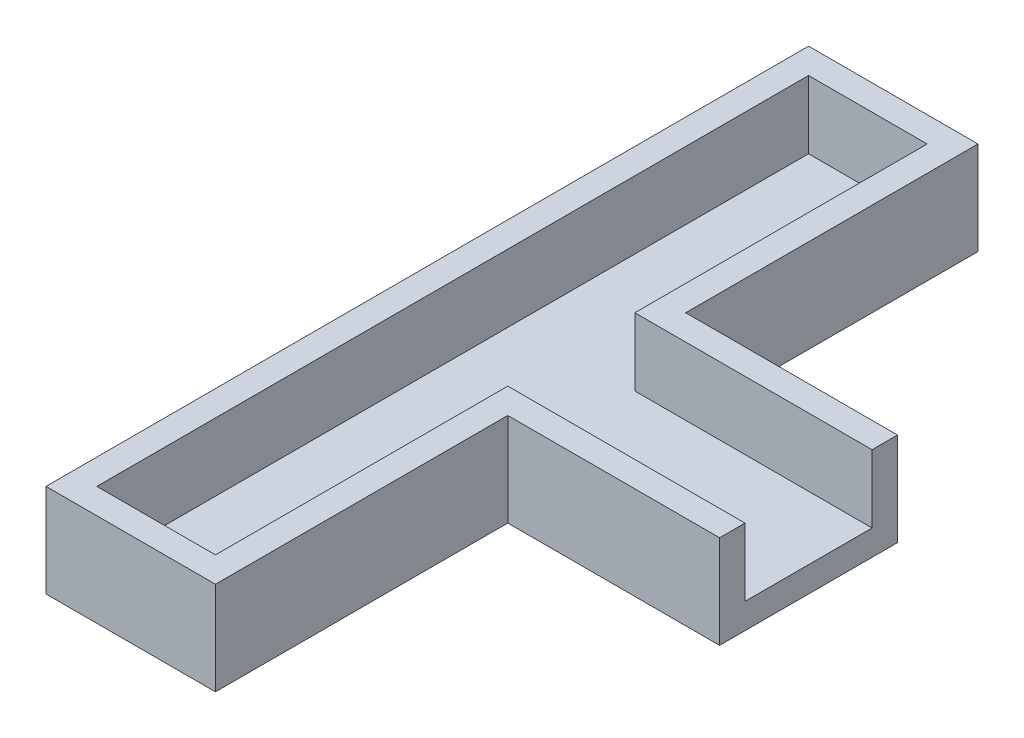
ISO-10303-21;
HEADER;
FILE_DESCRIPTION(('STEP AP214'),'2;1');
FILE_NAME('part.step','',(''),(''),'','','');
FILE_SCHEMA(('AUTOMOTIVE_DESIGN { 1 0 10303 214 1 1 1 1 }'));
ENDSEC;
DATA;
#1=APPLICATION_CONTEXT('core data for automotive mechanical design processes');
#2=APPLICATION_PROTOCOL_DEFINITION('international standard','automotive_design',2000,#1);
#3=PRODUCT_CONTEXT('',#1,'mechanical');
#4=PRODUCT('Part','Part','',(#3));
#5=PRODUCT_RELATED_PRODUCT_CATEGORY('part','',(#4));
#6=PRODUCT_DEFINITION_FORMATION('','',#4);
#7=PRODUCT_DEFINITION_CONTEXT('part definition',#1,'design');
#8=PRODUCT_DEFINITION('design','',#6,#7);
#9=PRODUCT_DEFINITION_SHAPE('','',#8);
#10=(LENGTH_UNIT() NAMED_UNIT(*) SI_UNIT(.MILLI.,.METRE.));
#11=(NAMED_UNIT(*) PLANE_ANGLE_UNIT() SI_UNIT($,.RADIAN.));
#12=(NAMED_UNIT(*) SI_UNIT($,.STERADIAN.) SOLID_ANGLE_UNIT());
#13=UNCERTAINTY_MEASURE_WITH_UNIT(LENGTH_MEASURE(1.E-05),#10,'distance_accuracy_value','');
#14=(GEOMETRIC_REPRESENTATION_CONTEXT(3) GLOBAL_UNCERTAINTY_ASSIGNED_CONTEXT((#13)) GLOBAL_UNIT_ASSIGNED_CONTEXT((#10,
#11,#12)) REPRESENTATION_CONTEXT('',''));
#15=CARTESIAN_POINT('',(0.,0.,0.));
#16=DIRECTION('',(0.,0.,1.));
#17=DIRECTION('',(1.,0.,0.));
#18=AXIS2_PLACEMENT_3D('',#15,#16,#17);
#19=CARTESIAN_POINT('',(16.,2.4,0.));
#20=DIRECTION('',(-1.,0.,0.));
#21=DIRECTION('',(0.,0.,1.));
#22=AXIS2_PLACEMENT_3D('',#19,#20,#21);
#23=PLANE('',#22);
#24=DIRECTION('',(0.,-1.,0.));
#25=VECTOR('',#24,1.);
#26=CARTESIAN_POINT('',(16.,0.,-27.6));
#27=LINE('',#26,#25);
#28=CARTESIAN_POINT('',(16.,8.8,-27.6));
#29=VERTEX_POINT('',#28);
#30=CARTESIAN_POINT('',(16.,0.,-27.6));
#31=VERTEX_POINT('',#30);
#32=EDGE_CURVE('E171',#29,#31,#27,.T.);
#33=ORIENTED_EDGE('',*,*,#32,.F.);
#34=DIRECTION('',(0.,0.,-1.));
#35=VECTOR('',#34,1.);
#36=CARTESIAN_POINT('',(16.,8.8,0.));
#37=LINE('',#36,#35);
#38=CARTESIAN_POINT('',(16.,8.8,0.));
#39=VERTEX_POINT('',#38);
#40=EDGE_CURVE('E247',#39,#29,#37,.T.);
#41=ORIENTED_EDGE('',*,*,#40,.F.);
#42=DIRECTION('',(0.,-1.,0.));
#43=VECTOR('',#42,1.);
#44=CARTESIAN_POINT('',(16.,2.4,0.));
#45=LINE('',#44,#43);
#46=CARTESIAN_POINT('',(16.,0.,0.));
#47=VERTEX_POINT('',#46);
#48=EDGE_CURVE('E43',#39,#47,#45,.T.);
#49=ORIENTED_EDGE('',*,*,#48,.T.);
#50=DIRECTION('',(0.,0.,-1.));
#51=VECTOR('',#50,1.);
#52=CARTESIAN_POINT('',(16.,0.,0.));
#53=LINE('',#52,#51);
#54=EDGE_CURVE('E258',#47,#31,#53,.T.);
#55=ORIENTED_EDGE('',*,*,#54,.T.);
#56=EDGE_LOOP('',(#33,#41,#49,#55));
#57=FACE_BOUND('',#56,.T.);
#58=ADVANCED_FACE('F35',(#57),#23,.F.);
#59=CARTESIAN_POINT('',(13.6,8.8,-2.4));
#60=DIRECTION('',(-1.,0.,0.));
#61=DIRECTION('',(0.,0.,1.));
#62=AXIS2_PLACEMENT_3D('',#59,#60,#61);
#63=PLANE('',#62);
#64=DIRECTION('',(0.,1.,0.));
#65=VECTOR('',#64,1.);
#66=CARTESIAN_POINT('',(13.6,8.8,-30.));
#67=LINE('',#66,#65);
#68=CARTESIAN_POINT('',(13.6,2.4,-30.));
#69=VERTEX_POINT('',#68);
#70=CARTESIAN_POINT('',(13.6,8.8,-30.));
#71=VERTEX_POINT('',#70);
#72=EDGE_CURVE('E205',#69,#71,#67,.T.);
#73=ORIENTED_EDGE('',*,*,#72,.F.);
#74=DIRECTION('',(0.,0.,-1.));
#75=VECTOR('',#74,1.);
#76=CARTESIAN_POINT('',(13.6,2.4,-2.4));
#77=LINE('',#76,#75);
#78=CARTESIAN_POINT('',(13.6,2.4,-2.4));
#79=VERTEX_POINT('',#78);
#80=EDGE_CURVE('E224',#79,#69,#77,.T.);
#81=ORIENTED_EDGE('',*,*,#80,.F.);
#82=DIRECTION('',(0.,-1.,0.));
#83=VECTOR('',#82,1.);
#84=CARTESIAN_POINT('',(13.6,8.8,-2.4));
#85=LINE('',#84,#83);
#86=CARTESIAN_POINT('',(13.6,8.8,-2.4));
#87=VERTEX_POINT('',#86);
#88=EDGE_CURVE('E238',#87,#79,#85,.T.);
#89=ORIENTED_EDGE('',*,*,#88,.F.);
#90=DIRECTION('',(0.,0.,-1.));
#91=VECTOR('',#90,1.);
#92=CARTESIAN_POINT('',(13.6,8.8,-2.4));
#93=LINE('',#92,#91);
#94=EDGE_CURVE('E212',#87,#71,#93,.T.);
#95=ORIENTED_EDGE('',*,*,#94,.T.);
#96=EDGE_LOOP('',(#73,#81,#89,#95));
#97=FACE_BOUND('',#96,.T.);
#98=ADVANCED_FACE('F299',(#97),#63,.T.);
#99=CARTESIAN_POINT('',(0.,2.4,0.));
#100=DIRECTION('',(1.,0.,0.));
#101=DIRECTION('',(0.,0.,-1.));
#102=AXIS2_PLACEMENT_3D('',#99,#100,#101);
#103=PLANE('',#102);
#104=DIRECTION('',(0.,0.,1.));
#105=VECTOR('',#104,1.);
#106=CARTESIAN_POINT('',(0.,0.,0.));
#107=LINE('',#106,#105);
#108=CARTESIAN_POINT('',(0.,0.,-72.));
#109=VERTEX_POINT('',#108);
#110=CARTESIAN_POINT('',(0.,0.,0.));
#111=VERTEX_POINT('',#110);
#112=EDGE_CURVE('E252',#109,#111,#107,.T.);
#113=ORIENTED_EDGE('',*,*,#112,.T.);
#114=DIRECTION('',(0.,-1.,0.));
#115=VECTOR('',#114,1.);
#116=CARTESIAN_POINT('',(0.,2.4,0.));
#117=LINE('',#116,#115);
#118=CARTESIAN_POINT('',(0.,8.8,0.));
#119=VERTEX_POINT('',#118);
#120=EDGE_CURVE('E11',#119,#111,#117,.T.);
#121=ORIENTED_EDGE('',*,*,#120,.F.);
#122=DIRECTION('',(0.,0.,1.));
#123=VECTOR('',#122,1.);
#124=CARTESIAN_POINT('',(0.,8.8,0.));
#125=LINE('',#124,#123);
#126=CARTESIAN_POINT('',(0.,8.8,-72.));
#127=VERTEX_POINT('',#126);
#128=EDGE_CURVE('E241',#127,#119,#125,.T.);
#129=ORIENTED_EDGE('',*,*,#128,.F.);
#130=DIRECTION('',(0.,-1.,0.));
#131=VECTOR('',#130,1.);
#132=CARTESIAN_POINT('',(0.,2.4,-72.));
#133=LINE('',#132,#131);
#134=EDGE_CURVE('E262',#127,#109,#133,.T.);
#135=ORIENTED_EDGE('',*,*,#134,.T.);
#136=EDGE_LOOP('',(#113,#121,#129,#135));
#137=FACE_BOUND('',#136,.T.);
#138=ADVANCED_FACE('F37',(#137),#103,.F.);
#139=CARTESIAN_POINT('',(0.,2.4,0.));
#140=DIRECTION('',(0.,0.,-1.));
#141=DIRECTION('',(-1.,0.,0.));
#142=AXIS2_PLACEMENT_3D('',#139,#140,#141);
#143=PLANE('',#142);
#144=DIRECTION('',(1.,0.,0.));
#145=VECTOR('',#144,1.);
#146=CARTESIAN_POINT('',(0.,0.,0.));
#147=LINE('',#146,#145);
#148=EDGE_CURVE('E255',#111,#47,#147,.T.);
#149=ORIENTED_EDGE('',*,*,#148,.T.);
#150=ORIENTED_EDGE('',*,*,#48,.F.);
#151=DIRECTION('',(1.,0.,0.));
#152=VECTOR('',#151,1.);
#153=CARTESIAN_POINT('',(0.,8.8,0.));
#154=LINE('',#153,#152);
#155=EDGE_CURVE('E244',#119,#39,#154,.T.);
#156=ORIENTED_EDGE('',*,*,#155,.F.);
#157=ORIENTED_EDGE('',*,*,#120,.T.);
#158=EDGE_LOOP('',(#149,#150,#156,#157));
#159=FACE_BOUND('',#158,.T.);
#160=ADVANCED_FACE('F283',(#159),#143,.F.);
#161=CARTESIAN_POINT('',(16.,8.8,-44.4));
#162=VERTEX_POINT('',#161);
#163=CARTESIAN_POINT('',(16.,8.8,-72.));
#164=VERTEX_POINT('',#163);
#165=EDGE_CURVE('E50',#162,#164,#37,.T.);
#166=ORIENTED_EDGE('',*,*,#165,.F.);
#167=DIRECTION('',(0.,-1.,0.));
#168=VECTOR('',#167,1.);
#169=CARTESIAN_POINT('',(16.,0.,-44.4));
#170=LINE('',#169,#168);
#171=CARTESIAN_POINT('',(16.,0.,-44.4));
#172=VERTEX_POINT('',#171);
#173=EDGE_CURVE('E55',#162,#172,#170,.T.);
#174=ORIENTED_EDGE('',*,*,#173,.T.);
#175=CARTESIAN_POINT('',(16.,0.,-72.));
#176=VERTEX_POINT('',#175);
#177=EDGE_CURVE('E257',#172,#176,#53,.T.);
#178=ORIENTED_EDGE('',*,*,#177,.T.);
#179=DIRECTION('',(0.,-1.,0.));
#180=VECTOR('',#179,1.);
#181=CARTESIAN_POINT('',(16.,2.4,-72.));
#182=LINE('',#181,#180);
#183=EDGE_CURVE('E265',#164,#176,#182,.T.);
#184=ORIENTED_EDGE('',*,*,#183,.F.);
#185=EDGE_LOOP('',(#166,#174,#178,#184));
#186=FACE_BOUND('',#185,.T.);
#187=ADVANCED_FACE('F289',(#186),#23,.F.);
#188=CARTESIAN_POINT('',(0.,2.4,-72.));
#189=DIRECTION('',(0.,0.,1.));
#190=DIRECTION('',(1.,0.,0.));
#191=AXIS2_PLACEMENT_3D('',#188,#189,#190);
#192=PLANE('',#191);
#193=DIRECTION('',(-1.,0.,0.));
#194=VECTOR('',#193,1.);
#195=CARTESIAN_POINT('',(0.,0.,-72.));
#196=LINE('',#195,#194);
#197=EDGE_CURVE('E260',#176,#109,#196,.T.);
#198=ORIENTED_EDGE('',*,*,#197,.T.);
#199=ORIENTED_EDGE('',*,*,#134,.F.);
#200=DIRECTION('',(-1.,0.,0.));
#201=VECTOR('',#200,1.);
#202=CARTESIAN_POINT('',(0.,8.8,-72.));
#203=LINE('',#202,#201);
#204=EDGE_CURVE('E249',#164,#127,#203,.T.);
#205=ORIENTED_EDGE('',*,*,#204,.F.);
#206=ORIENTED_EDGE('',*,*,#183,.T.);
#207=EDGE_LOOP('',(#198,#199,#205,#206));
#208=FACE_BOUND('',#207,.T.);
#209=ADVANCED_FACE('F287',(#208),#192,.F.);
#210=CARTESIAN_POINT('',(0.,0.,0.));
#211=DIRECTION('',(0.,-1.,0.));
#212=DIRECTION('',(0.,0.,-1.));
#213=AXIS2_PLACEMENT_3D('',#210,#211,#212);
#214=PLANE('',#213);
#215=ORIENTED_EDGE('',*,*,#112,.F.);
#216=ORIENTED_EDGE('',*,*,#197,.F.);
#217=ORIENTED_EDGE('',*,*,#177,.F.);
#218=DIRECTION('',(-1.,0.,0.));
#219=VECTOR('',#218,1.);
#220=CARTESIAN_POINT('',(36.,0.,-44.4));
#221=LINE('',#220,#219);
#222=CARTESIAN_POINT('',(36.,0.,-44.4));
#223=VERTEX_POINT('',#222);
#224=EDGE_CURVE('E188',#223,#172,#221,.T.);
#225=ORIENTED_EDGE('',*,*,#224,.F.);
#226=DIRECTION('',(0.,0.,-1.));
#227=VECTOR('',#226,1.);
#228=CARTESIAN_POINT('',(36.,0.,0.));
#229=LINE('',#228,#227);
#230=CARTESIAN_POINT('',(36.,0.,-27.6));
#231=VERTEX_POINT('',#230);
#232=EDGE_CURVE('E169',#231,#223,#229,.T.);
#233=ORIENTED_EDGE('',*,*,#232,.F.);
#234=DIRECTION('',(-1.,0.,0.));
#235=VECTOR('',#234,1.);
#236=CARTESIAN_POINT('',(36.,0.,-27.6));
#237=LINE('',#236,#235);
#238=EDGE_CURVE('E191',#231,#31,#237,.T.);
#239=ORIENTED_EDGE('',*,*,#238,.T.);
#240=ORIENTED_EDGE('',*,*,#54,.F.);
#241=ORIENTED_EDGE('',*,*,#148,.F.);
#242=EDGE_LOOP('',(#215,#216,#217,#225,#233,#239,#240,#241));
#243=FACE_BOUND('',#242,.T.);
#244=ADVANCED_FACE('F275',(#243),#214,.T.);
#245=CARTESIAN_POINT('',(0.,8.8,0.));
#246=DIRECTION('',(0.,-1.,0.));
#247=DIRECTION('',(0.,0.,-1.));
#248=AXIS2_PLACEMENT_3D('',#245,#246,#247);
#249=PLANE('',#248);
#250=ORIENTED_EDGE('',*,*,#40,.T.);
#251=DIRECTION('',(-1.,0.,0.));
#252=VECTOR('',#251,1.);
#253=CARTESIAN_POINT('',(36.,8.8,-27.6));
#254=LINE('',#253,#252);
#255=CARTESIAN_POINT('',(36.,8.8,-27.6));
#256=VERTEX_POINT('',#255);
#257=EDGE_CURVE('E154',#256,#29,#254,.T.);
#258=ORIENTED_EDGE('',*,*,#257,.F.);
#259=DIRECTION('',(0.,0.,1.));
#260=VECTOR('',#259,1.);
#261=CARTESIAN_POINT('',(36.,8.8,0.));
#262=LINE('',#261,#260);
#263=CARTESIAN_POINT('',(36.,8.8,-30.));
#264=VERTEX_POINT('',#263);
#265=EDGE_CURVE('E183',#264,#256,#262,.T.);
#266=ORIENTED_EDGE('',*,*,#265,.F.);
#267=DIRECTION('',(1.,0.,0.));
#268=VECTOR('',#267,1.);
#269=CARTESIAN_POINT('',(11.2,8.8,-30.));
#270=LINE('',#269,#268);
#271=EDGE_CURVE('E196',#71,#264,#270,.T.);
#272=ORIENTED_EDGE('',*,*,#271,.F.);
#273=ORIENTED_EDGE('',*,*,#94,.F.);
#274=DIRECTION('',(1.,0.,0.));
#275=VECTOR('',#274,1.);
#276=CARTESIAN_POINT('',(2.4,8.8,-2.4));
#277=LINE('',#276,#275);
#278=CARTESIAN_POINT('',(2.4,8.8,-2.4));
#279=VERTEX_POINT('',#278);
#280=EDGE_CURVE('E208',#279,#87,#277,.T.);
#281=ORIENTED_EDGE('',*,*,#280,.F.);
#282=DIRECTION('',(0.,0.,1.));
#283=VECTOR('',#282,1.);
#284=CARTESIAN_POINT('',(2.4,8.8,-2.4));
#285=LINE('',#284,#283);
#286=CARTESIAN_POINT('',(2.4,8.8,-69.6));
#287=VERTEX_POINT('',#286);
#288=EDGE_CURVE('E218',#287,#279,#285,.T.);
#289=ORIENTED_EDGE('',*,*,#288,.F.);
#290=DIRECTION('',(-1.,0.,0.));
#291=VECTOR('',#290,1.);
#292=CARTESIAN_POINT('',(2.4,8.8,-69.6));
#293=LINE('',#292,#291);
#294=CARTESIAN_POINT('',(13.6,8.8,-69.6));
#295=VERTEX_POINT('',#294);
#296=EDGE_CURVE('E215',#295,#287,#293,.T.);
#297=ORIENTED_EDGE('',*,*,#296,.F.);
#298=CARTESIAN_POINT('',(13.6,8.8,-42.));
#299=VERTEX_POINT('',#298);
#300=EDGE_CURVE('E210',#299,#295,#93,.T.);
#301=ORIENTED_EDGE('',*,*,#300,.F.);
#302=DIRECTION('',(1.,0.,0.));
#303=VECTOR('',#302,1.);
#304=CARTESIAN_POINT('',(11.2,8.8,-42.));
#305=LINE('',#304,#303);
#306=CARTESIAN_POINT('',(36.,8.8,-42.));
#307=VERTEX_POINT('',#306);
#308=EDGE_CURVE('E161',#299,#307,#305,.T.);
#309=ORIENTED_EDGE('',*,*,#308,.T.);
#310=DIRECTION('',(0.,0.,1.));
#311=VECTOR('',#310,1.);
#312=CARTESIAN_POINT('',(36.,8.8,0.));
#313=LINE('',#312,#311);
#314=CARTESIAN_POINT('',(36.,8.8,-44.4));
#315=VERTEX_POINT('',#314);
#316=EDGE_CURVE('E157',#315,#307,#313,.T.);
#317=ORIENTED_EDGE('',*,*,#316,.F.);
#318=DIRECTION('',(-1.,0.,0.));
#319=VECTOR('',#318,1.);
#320=CARTESIAN_POINT('',(36.,8.8,-44.4));
#321=LINE('',#320,#319);
#322=EDGE_CURVE('E146',#315,#162,#321,.T.);
#323=ORIENTED_EDGE('',*,*,#322,.T.);
#324=ORIENTED_EDGE('',*,*,#165,.T.);
#325=ORIENTED_EDGE('',*,*,#204,.T.);
#326=ORIENTED_EDGE('',*,*,#128,.T.);
#327=ORIENTED_EDGE('',*,*,#155,.T.);
#328=EDGE_LOOP('',(#250,#258,#266,#272,#273,#281,#289,#297,#301,#309,#317,#323,#324,#325,#326,#327));
#329=FACE_BOUND('',#328,.T.);
#330=ADVANCED_FACE('F159',(#329),#249,.F.);
#331=CARTESIAN_POINT('',(2.4,8.8,-2.4));
#332=DIRECTION('',(0.,0.,-1.));
#333=DIRECTION('',(-1.,0.,0.));
#334=AXIS2_PLACEMENT_3D('',#331,#332,#333);
#335=PLANE('',#334);
#336=DIRECTION('',(1.,0.,0.));
#337=VECTOR('',#336,1.);
#338=CARTESIAN_POINT('',(2.4,2.4,-2.4));
#339=LINE('',#338,#337);
#340=CARTESIAN_POINT('',(2.4,2.4,-2.4));
#341=VERTEX_POINT('',#340);
#342=EDGE_CURVE('E207',#341,#79,#339,.T.);
#343=ORIENTED_EDGE('',*,*,#342,.F.);
#344=DIRECTION('',(0.,-1.,0.));
#345=VECTOR('',#344,1.);
#346=CARTESIAN_POINT('',(2.4,8.8,-2.4));
#347=LINE('',#346,#345);
#348=EDGE_CURVE('E220',#279,#341,#347,.T.);
#349=ORIENTED_EDGE('',*,*,#348,.F.);
#350=ORIENTED_EDGE('',*,*,#280,.T.);
#351=ORIENTED_EDGE('',*,*,#88,.T.);
#352=EDGE_LOOP('',(#343,#349,#350,#351));
#353=FACE_BOUND('',#352,.T.);
#354=ADVANCED_FACE('F315',(#353),#335,.T.);
#355=DIRECTION('',(0.,-1.,0.));
#356=VECTOR('',#355,1.);
#357=CARTESIAN_POINT('',(13.6,8.8,-42.));
#358=LINE('',#357,#356);
#359=CARTESIAN_POINT('',(13.6,2.4,-42.));
#360=VERTEX_POINT('',#359);
#361=EDGE_CURVE('E198',#299,#360,#358,.T.);
#362=ORIENTED_EDGE('',*,*,#361,.F.);
#363=ORIENTED_EDGE('',*,*,#300,.T.);
#364=DIRECTION('',(0.,-1.,0.));
#365=VECTOR('',#364,1.);
#366=CARTESIAN_POINT('',(13.6,8.8,-69.6));
#367=LINE('',#366,#365);
#368=CARTESIAN_POINT('',(13.6,2.4,-69.6));
#369=VERTEX_POINT('',#368);
#370=EDGE_CURVE('E235',#295,#369,#367,.T.);
#371=ORIENTED_EDGE('',*,*,#370,.T.);
#372=EDGE_CURVE('E223',#360,#369,#77,.T.);
#373=ORIENTED_EDGE('',*,*,#372,.F.);
#374=EDGE_LOOP('',(#362,#363,#371,#373));
#375=FACE_BOUND('',#374,.T.);
#376=ADVANCED_FACE('F306',(#375),#63,.T.);
#377=CARTESIAN_POINT('',(2.4,8.8,-69.6));
#378=DIRECTION('',(0.,0.,1.));
#379=DIRECTION('',(1.,0.,0.));
#380=AXIS2_PLACEMENT_3D('',#377,#378,#379);
#381=PLANE('',#380);
#382=DIRECTION('',(-1.,0.,0.));
#383=VECTOR('',#382,1.);
#384=CARTESIAN_POINT('',(2.4,2.4,-69.6));
#385=LINE('',#384,#383);
#386=CARTESIAN_POINT('',(2.4,2.4,-69.6));
#387=VERTEX_POINT('',#386);
#388=EDGE_CURVE('E227',#369,#387,#385,.T.);
#389=ORIENTED_EDGE('',*,*,#388,.F.);
#390=ORIENTED_EDGE('',*,*,#370,.F.);
#391=ORIENTED_EDGE('',*,*,#296,.T.);
#392=DIRECTION('',(0.,-1.,0.));
#393=VECTOR('',#392,1.);
#394=CARTESIAN_POINT('',(2.4,8.8,-69.6));
#395=LINE('',#394,#393);
#396=EDGE_CURVE('E233',#287,#387,#395,.T.);
#397=ORIENTED_EDGE('',*,*,#396,.T.);
#398=EDGE_LOOP('',(#389,#390,#391,#397));
#399=FACE_BOUND('',#398,.T.);
#400=ADVANCED_FACE('F314',(#399),#381,.T.);
#401=CARTESIAN_POINT('',(2.4,8.8,-2.4));
#402=DIRECTION('',(1.,0.,0.));
#403=DIRECTION('',(0.,0.,-1.));
#404=AXIS2_PLACEMENT_3D('',#401,#402,#403);
#405=PLANE('',#404);
#406=DIRECTION('',(0.,0.,1.));
#407=VECTOR('',#406,1.);
#408=CARTESIAN_POINT('',(2.4,2.4,-2.4));
#409=LINE('',#408,#407);
#410=EDGE_CURVE('E211',#387,#341,#409,.T.);
#411=ORIENTED_EDGE('',*,*,#410,.F.);
#412=ORIENTED_EDGE('',*,*,#396,.F.);
#413=ORIENTED_EDGE('',*,*,#288,.T.);
#414=ORIENTED_EDGE('',*,*,#348,.T.);
#415=EDGE_LOOP('',(#411,#412,#413,#414));
#416=FACE_BOUND('',#415,.T.);
#417=ADVANCED_FACE('F320',(#416),#405,.T.);
#418=CARTESIAN_POINT('',(0.,2.4,0.));
#419=DIRECTION('',(0.,-1.,0.));
#420=DIRECTION('',(0.,0.,-1.));
#421=AXIS2_PLACEMENT_3D('',#418,#419,#420);
#422=PLANE('',#421);
#423=ORIENTED_EDGE('',*,*,#80,.T.);
#424=DIRECTION('',(1.,0.,0.));
#425=VECTOR('',#424,1.);
#426=CARTESIAN_POINT('',(11.2,2.4,-30.));
#427=LINE('',#426,#425);
#428=CARTESIAN_POINT('',(36.,2.4,-30.));
#429=VERTEX_POINT('',#428);
#430=EDGE_CURVE('E153',#69,#429,#427,.T.);
#431=ORIENTED_EDGE('',*,*,#430,.T.);
#432=DIRECTION('',(0.,0.,1.));
#433=VECTOR('',#432,1.);
#434=CARTESIAN_POINT('',(36.,2.4,0.));
#435=LINE('',#434,#433);
#436=CARTESIAN_POINT('',(36.,2.4,-42.));
#437=VERTEX_POINT('',#436);
#438=EDGE_CURVE('E177',#437,#429,#435,.T.);
#439=ORIENTED_EDGE('',*,*,#438,.F.);
#440=DIRECTION('',(1.,0.,0.));
#441=VECTOR('',#440,1.);
#442=CARTESIAN_POINT('',(11.2,2.4,-42.));
#443=LINE('',#442,#441);
#444=EDGE_CURVE('E200',#360,#437,#443,.T.);
#445=ORIENTED_EDGE('',*,*,#444,.F.);
#446=ORIENTED_EDGE('',*,*,#372,.T.);
#447=ORIENTED_EDGE('',*,*,#388,.T.);
#448=ORIENTED_EDGE('',*,*,#410,.T.);
#449=ORIENTED_EDGE('',*,*,#342,.T.);
#450=EDGE_LOOP('',(#423,#431,#439,#445,#446,#447,#448,#449));
#451=FACE_BOUND('',#450,.T.);
#452=ADVANCED_FACE('F334',(#451),#422,.F.);
#453=CARTESIAN_POINT('',(11.2,8.8,-30.));
#454=DIRECTION('',(0.,0.,1.));
#455=DIRECTION('',(1.,0.,0.));
#456=AXIS2_PLACEMENT_3D('',#453,#454,#455);
#457=PLANE('',#456);
#458=ORIENTED_EDGE('',*,*,#72,.T.);
#459=ORIENTED_EDGE('',*,*,#271,.T.);
#460=DIRECTION('',(0.,1.,0.));
#461=VECTOR('',#460,1.);
#462=CARTESIAN_POINT('',(36.,0.,-30.));
#463=LINE('',#462,#461);
#464=EDGE_CURVE('E180',#429,#264,#463,.T.);
#465=ORIENTED_EDGE('',*,*,#464,.F.);
#466=ORIENTED_EDGE('',*,*,#430,.F.);
#467=EDGE_LOOP('',(#458,#459,#465,#466));
#468=FACE_BOUND('',#467,.T.);
#469=ADVANCED_FACE('F339',(#468),#457,.F.);
#470=CARTESIAN_POINT('',(11.2,8.8,-42.));
#471=DIRECTION('',(0.,0.,-1.));
#472=DIRECTION('',(-1.,0.,0.));
#473=AXIS2_PLACEMENT_3D('',#470,#471,#472);
#474=PLANE('',#473);
#475=ORIENTED_EDGE('',*,*,#361,.T.);
#476=ORIENTED_EDGE('',*,*,#444,.T.);
#477=DIRECTION('',(0.,-1.,0.));
#478=VECTOR('',#477,1.);
#479=CARTESIAN_POINT('',(36.,0.,-42.));
#480=LINE('',#479,#478);
#481=EDGE_CURVE('E165',#307,#437,#480,.T.);
#482=ORIENTED_EDGE('',*,*,#481,.F.);
#483=ORIENTED_EDGE('',*,*,#308,.F.);
#484=EDGE_LOOP('',(#475,#476,#482,#483));
#485=FACE_BOUND('',#484,.T.);
#486=ADVANCED_FACE('F336',(#485),#474,.F.);
#487=CARTESIAN_POINT('',(36.,0.,-44.4));
#488=DIRECTION('',(0.,0.,-1.));
#489=DIRECTION('',(-1.,0.,0.));
#490=AXIS2_PLACEMENT_3D('',#487,#488,#489);
#491=PLANE('',#490);
#492=ORIENTED_EDGE('',*,*,#173,.F.);
#493=ORIENTED_EDGE('',*,*,#322,.F.);
#494=DIRECTION('',(0.,-1.,0.));
#495=VECTOR('',#494,1.);
#496=CARTESIAN_POINT('',(36.,0.,-44.4));
#497=LINE('',#496,#495);
#498=EDGE_CURVE('E151',#315,#223,#497,.T.);
#499=ORIENTED_EDGE('',*,*,#498,.T.);
#500=ORIENTED_EDGE('',*,*,#224,.T.);
#501=EDGE_LOOP('',(#492,#493,#499,#500));
#502=FACE_BOUND('',#501,.T.);
#503=ADVANCED_FACE('F148',(#502),#491,.T.);
#504=CARTESIAN_POINT('',(36.,0.,-27.6));
#505=DIRECTION('',(0.,0.,-1.));
#506=DIRECTION('',(-1.,0.,0.));
#507=AXIS2_PLACEMENT_3D('',#504,#505,#506);
#508=PLANE('',#507);
#509=ORIENTED_EDGE('',*,*,#32,.T.);
#510=ORIENTED_EDGE('',*,*,#238,.F.);
#511=DIRECTION('',(0.,-1.,0.));
#512=VECTOR('',#511,1.);
#513=CARTESIAN_POINT('',(36.,0.,-27.6));
#514=LINE('',#513,#512);
#515=EDGE_CURVE('E185',#256,#231,#514,.T.);
#516=ORIENTED_EDGE('',*,*,#515,.F.);
#517=ORIENTED_EDGE('',*,*,#257,.T.);
#518=EDGE_LOOP('',(#509,#510,#516,#517));
#519=FACE_BOUND('',#518,.T.);
#520=ADVANCED_FACE('F279',(#519),#508,.F.);
#521=CARTESIAN_POINT('',(36.,0.,0.));
#522=DIRECTION('',(1.,0.,0.));
#523=DIRECTION('',(0.,0.,-1.));
#524=AXIS2_PLACEMENT_3D('',#521,#522,#523);
#525=PLANE('',#524);
#526=ORIENTED_EDGE('',*,*,#498,.F.);
#527=ORIENTED_EDGE('',*,*,#316,.T.);
#528=ORIENTED_EDGE('',*,*,#481,.T.);
#529=ORIENTED_EDGE('',*,*,#438,.T.);
#530=ORIENTED_EDGE('',*,*,#464,.T.);
#531=ORIENTED_EDGE('',*,*,#265,.T.);
#532=ORIENTED_EDGE('',*,*,#515,.T.);
#533=ORIENTED_EDGE('',*,*,#232,.T.);
#534=EDGE_LOOP('',(#526,#527,#528,#529,#530,#531,#532,#533));
#535=FACE_BOUND('',#534,.T.);
#536=ADVANCED_FACE('F167',(#535),#525,.T.);
#537=CLOSED_SHELL('',(#58,#98,#138,#160,#187,#209,#244,#330,#354,#376,#400,#417,#452,#469,#486,
#503,#520,#536));
#538=MANIFOLD_SOLID_BREP('B2',#537);
#539=ADVANCED_BREP_SHAPE_REPRESENTATION('',(#18,#538),#14);
#540=SHAPE_DEFINITION_REPRESENTATION(#9,#539);
ENDSEC;
END-ISO-10303-21;
